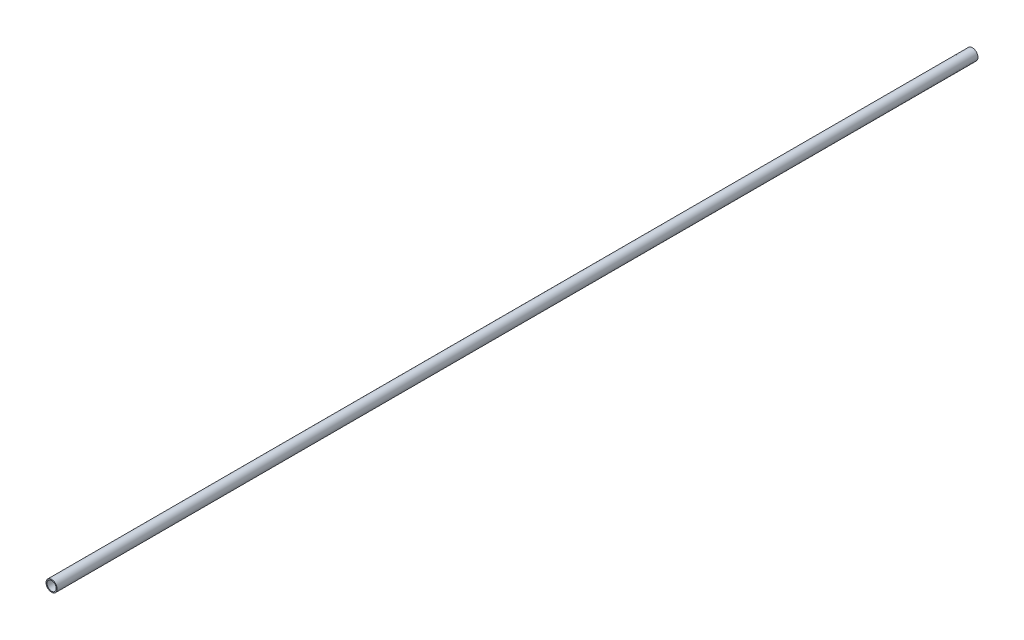
ISO-10303-21;
HEADER;
FILE_DESCRIPTION(('STEP AP214'),'2;1');
FILE_NAME('part.step','',(''),(''),'','','');
FILE_SCHEMA(('AUTOMOTIVE_DESIGN { 1 0 10303 214 1 1 1 1 }'));
ENDSEC;
DATA;
#1=APPLICATION_CONTEXT('core data for automotive mechanical design processes');
#2=APPLICATION_PROTOCOL_DEFINITION('international standard','automotive_design',2000,#1);
#3=PRODUCT_CONTEXT('',#1,'mechanical');
#4=PRODUCT('Part','Part','',(#3));
#5=PRODUCT_RELATED_PRODUCT_CATEGORY('part','',(#4));
#6=PRODUCT_DEFINITION_FORMATION('','',#4);
#7=PRODUCT_DEFINITION_CONTEXT('part definition',#1,'design');
#8=PRODUCT_DEFINITION('design','',#6,#7);
#9=PRODUCT_DEFINITION_SHAPE('','',#8);
#10=(LENGTH_UNIT() NAMED_UNIT(*) SI_UNIT(.MILLI.,.METRE.));
#11=(NAMED_UNIT(*) PLANE_ANGLE_UNIT() SI_UNIT($,.RADIAN.));
#12=(NAMED_UNIT(*) SI_UNIT($,.STERADIAN.) SOLID_ANGLE_UNIT());
#13=UNCERTAINTY_MEASURE_WITH_UNIT(LENGTH_MEASURE(1.E-05),#10,'distance_accuracy_value','');
#14=(GEOMETRIC_REPRESENTATION_CONTEXT(3) GLOBAL_UNCERTAINTY_ASSIGNED_CONTEXT((#13)) GLOBAL_UNIT_ASSIGNED_CONTEXT((#10,
#11,#12)) REPRESENTATION_CONTEXT('',''));
#15=CARTESIAN_POINT('',(0.,0.,0.));
#16=DIRECTION('',(0.,0.,1.));
#17=DIRECTION('',(1.,0.,0.));
#18=AXIS2_PLACEMENT_3D('',#15,#16,#17);
#19=CARTESIAN_POINT('',(0.,0.,3473.45));
#20=DIRECTION('',(0.,0.,1.));
#21=DIRECTION('',(1.,0.,0.));
#22=AXIS2_PLACEMENT_3D('',#19,#20,#21);
#23=PLANE('',#22);
#24=CARTESIAN_POINT('',(0.,0.,3473.45));
#25=DIRECTION('',(0.,0.,1.));
#26=DIRECTION('',(1.,0.,0.));
#27=AXIS2_PLACEMENT_3D('',#24,#25,#26);
#28=CIRCLE('',#27,21.082);
#29=CARTESIAN_POINT('',(21.082,0.,3473.45));
#30=VERTEX_POINT('',#29);
#31=EDGE_CURVE('E10',#30,#30,#28,.T.);
#32=ORIENTED_EDGE('',*,*,#31,.T.);
#33=EDGE_LOOP('',(#32));
#34=FACE_BOUND('',#33,.T.);
#35=CARTESIAN_POINT('',(0.,0.,3473.45));
#36=DIRECTION('',(0.,0.,1.));
#37=DIRECTION('',(1.,0.,0.));
#38=AXIS2_PLACEMENT_3D('',#35,#36,#37);
#39=CIRCLE('',#38,17.526);
#40=CARTESIAN_POINT('',(17.526,0.,3473.45));
#41=VERTEX_POINT('',#40);
#42=EDGE_CURVE('E48',#41,#41,#39,.T.);
#43=ORIENTED_EDGE('',*,*,#42,.F.);
#44=EDGE_LOOP('',(#43));
#45=FACE_BOUND('',#44,.T.);
#46=ADVANCED_FACE('F37',(#34,#45),#23,.T.);
#47=CARTESIAN_POINT('',(0.,0.,0.));
#48=DIRECTION('',(0.,0.,1.));
#49=DIRECTION('',(1.,0.,0.));
#50=AXIS2_PLACEMENT_3D('',#47,#48,#49);
#51=PLANE('',#50);
#52=CARTESIAN_POINT('',(0.,0.,0.));
#53=DIRECTION('',(0.,0.,1.));
#54=DIRECTION('',(1.,0.,0.));
#55=AXIS2_PLACEMENT_3D('',#52,#53,#54);
#56=CIRCLE('',#55,21.082);
#57=CARTESIAN_POINT('',(21.082,0.,0.));
#58=VERTEX_POINT('',#57);
#59=EDGE_CURVE('E41',#58,#58,#56,.T.);
#60=ORIENTED_EDGE('',*,*,#59,.F.);
#61=EDGE_LOOP('',(#60));
#62=FACE_BOUND('',#61,.T.);
#63=CARTESIAN_POINT('',(0.,0.,0.));
#64=DIRECTION('',(0.,0.,1.));
#65=DIRECTION('',(1.,0.,0.));
#66=AXIS2_PLACEMENT_3D('',#63,#64,#65);
#67=CIRCLE('',#66,17.526);
#68=CARTESIAN_POINT('',(17.526,0.,0.));
#69=VERTEX_POINT('',#68);
#70=EDGE_CURVE('E50',#69,#69,#67,.T.);
#71=ORIENTED_EDGE('',*,*,#70,.T.);
#72=EDGE_LOOP('',(#71));
#73=FACE_BOUND('',#72,.T.);
#74=ADVANCED_FACE('F60',(#62,#73),#51,.F.);
#75=CARTESIAN_POINT('',(0.,0.,3473.45));
#76=DIRECTION('',(0.,0.,-1.));
#77=DIRECTION('',(-1.,0.,0.));
#78=AXIS2_PLACEMENT_3D('',#75,#76,#77);
#79=CYLINDRICAL_SURFACE('',#78,21.082);
#80=ORIENTED_EDGE('',*,*,#31,.F.);
#81=EDGE_LOOP('',(#80));
#82=FACE_BOUND('',#81,.T.);
#83=ORIENTED_EDGE('',*,*,#59,.T.);
#84=EDGE_LOOP('',(#83));
#85=FACE_BOUND('',#84,.T.);
#86=ADVANCED_FACE('F39',(#82,#85),#79,.T.);
#87=CARTESIAN_POINT('',(0.,0.,3473.45));
#88=DIRECTION('',(0.,0.,-1.));
#89=DIRECTION('',(-1.,0.,0.));
#90=AXIS2_PLACEMENT_3D('',#87,#88,#89);
#91=CYLINDRICAL_SURFACE('',#90,17.526);
#92=ORIENTED_EDGE('',*,*,#42,.T.);
#93=EDGE_LOOP('',(#92));
#94=FACE_BOUND('',#93,.T.);
#95=ORIENTED_EDGE('',*,*,#70,.F.);
#96=EDGE_LOOP('',(#95));
#97=FACE_BOUND('',#96,.T.);
#98=ADVANCED_FACE('F56',(#94,#97),#91,.F.);
#99=CLOSED_SHELL('',(#46,#74,#86,#98));
#100=MANIFOLD_SOLID_BREP('B2',#99);
#101=ADVANCED_BREP_SHAPE_REPRESENTATION('',(#18,#100),#14);
#102=SHAPE_DEFINITION_REPRESENTATION(#9,#101);
ENDSEC;
END-ISO-10303-21;
